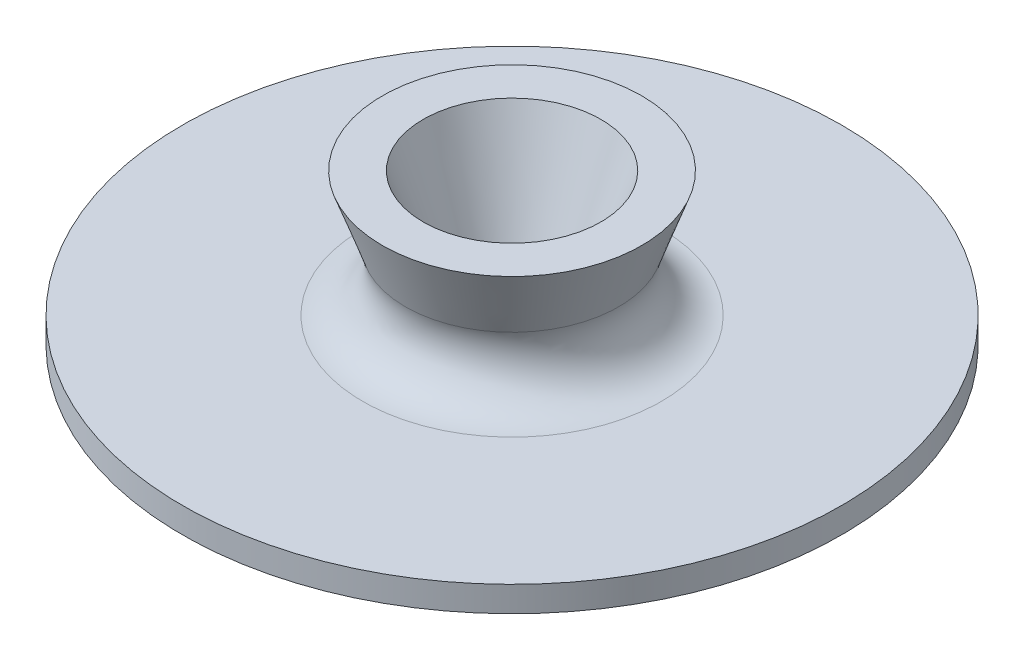
ISO-10303-21;
HEADER;
FILE_DESCRIPTION(('STEP AP214'),'2;1');
FILE_NAME('part.step','',(''),(''),'','','');
FILE_SCHEMA(('AUTOMOTIVE_DESIGN { 1 0 10303 214 1 1 1 1 }'));
ENDSEC;
DATA;
#1=APPLICATION_CONTEXT('core data for automotive mechanical design processes');
#2=APPLICATION_PROTOCOL_DEFINITION('international standard','automotive_design',2000,#1);
#3=PRODUCT_CONTEXT('',#1,'mechanical');
#4=PRODUCT('Part','Part','',(#3));
#5=PRODUCT_RELATED_PRODUCT_CATEGORY('part','',(#4));
#6=PRODUCT_DEFINITION_FORMATION('','',#4);
#7=PRODUCT_DEFINITION_CONTEXT('part definition',#1,'design');
#8=PRODUCT_DEFINITION('design','',#6,#7);
#9=PRODUCT_DEFINITION_SHAPE('','',#8);
#10=(LENGTH_UNIT() NAMED_UNIT(*) SI_UNIT(.MILLI.,.METRE.));
#11=(NAMED_UNIT(*) PLANE_ANGLE_UNIT() SI_UNIT($,.RADIAN.));
#12=(NAMED_UNIT(*) SI_UNIT($,.STERADIAN.) SOLID_ANGLE_UNIT());
#13=UNCERTAINTY_MEASURE_WITH_UNIT(LENGTH_MEASURE(1.E-05),#10,'distance_accuracy_value','');
#14=(GEOMETRIC_REPRESENTATION_CONTEXT(3) GLOBAL_UNCERTAINTY_ASSIGNED_CONTEXT((#13)) GLOBAL_UNIT_ASSIGNED_CONTEXT((#10,
#11,#12)) REPRESENTATION_CONTEXT('',''));
#15=CARTESIAN_POINT('',(0.,0.,0.));
#16=DIRECTION('',(0.,0.,1.));
#17=DIRECTION('',(1.,0.,0.));
#18=AXIS2_PLACEMENT_3D('',#15,#16,#17);
#19=CARTESIAN_POINT('',(-19.6076033884728,27.621968932787,0.));
#20=DIRECTION('',(0.,-1.,0.));
#21=DIRECTION('',(0.,0.,-1.));
#22=AXIS2_PLACEMENT_3D('',#19,#20,#21);
#23=PLANE('',#22);
#24=CARTESIAN_POINT('',(0.,27.621968932787,0.));
#25=DIRECTION('',(0.,-1.,0.));
#26=DIRECTION('',(0.,0.,-1.));
#27=AXIS2_PLACEMENT_3D('',#24,#25,#26);
#28=CIRCLE('',#27,28.6091637893943);
#29=CARTESIAN_POINT('',(0.,27.621968932787,-28.6091637893943));
#30=VERTEX_POINT('',#29);
#31=EDGE_CURVE('E55',#30,#30,#28,.T.);
#32=ORIENTED_EDGE('',*,*,#31,.F.);
#33=EDGE_LOOP('',(#32));
#34=FACE_BOUND('',#33,.T.);
#35=CARTESIAN_POINT('',(0.,27.621968932787,0.));
#36=DIRECTION('',(0.,-1.,0.));
#37=DIRECTION('',(0.,0.,-1.));
#38=AXIS2_PLACEMENT_3D('',#35,#36,#37);
#39=CIRCLE('',#38,19.6076033884728);
#40=CARTESIAN_POINT('',(0.,27.6219689327871,19.6076033884728));
#41=VERTEX_POINT('',#40);
#42=EDGE_CURVE('E50',#41,#41,#39,.T.);
#43=ORIENTED_EDGE('',*,*,#42,.T.);
#44=EDGE_LOOP('',(#43));
#45=FACE_BOUND('',#44,.T.);
#46=ADVANCED_FACE('F37',(#34,#45),#23,.F.);
#47=CARTESIAN_POINT('',(0.,27.621968932787,0.));
#48=DIRECTION('',(0.,1.,0.));
#49=DIRECTION('',(0.,0.,1.));
#50=AXIS2_PLACEMENT_3D('',#47,#48,#49);
#51=CONICAL_SURFACE('',#50,28.6091637893943,0.343023940420704);
#52=CARTESIAN_POINT('',(0.,13.3633639699816,0.));
#53=DIRECTION('',(0.,1.,0.));
#54=DIRECTION('',(0.,0.,1.));
#55=AXIS2_PLACEMENT_3D('',#52,#53,#54);
#56=CIRCLE('',#55,23.5168048741066);
#57=CARTESIAN_POINT('',(0.,13.3633639699816,23.5168048741066));
#58=VERTEX_POINT('',#57);
#59=EDGE_CURVE('E10',#58,#58,#56,.T.);
#60=ORIENTED_EDGE('',*,*,#59,.T.);
#61=EDGE_LOOP('',(#60));
#62=FACE_BOUND('',#61,.T.);
#63=ORIENTED_EDGE('',*,*,#31,.T.);
#64=EDGE_LOOP('',(#63));
#65=FACE_BOUND('',#64,.T.);
#66=ADVANCED_FACE('F110',(#62,#65),#51,.T.);
#67=CARTESIAN_POINT('',(-18.7441748848275,0.,0.));
#68=DIRECTION('',(0.,-1.,0.));
#69=DIRECTION('',(0.,0.,-1.));
#70=AXIS2_PLACEMENT_3D('',#67,#68,#69);
#71=PLANE('',#70);
#72=CARTESIAN_POINT('',(0.,0.,0.));
#73=DIRECTION('',(0.,-1.,0.));
#74=DIRECTION('',(0.,0.,-1.));
#75=AXIS2_PLACEMENT_3D('',#72,#73,#74);
#76=CIRCLE('',#75,32.934223990055);
#77=CARTESIAN_POINT('',(0.,0.,-32.934223990055));
#78=VERTEX_POINT('',#77);
#79=EDGE_CURVE('E45',#78,#78,#76,.T.);
#80=ORIENTED_EDGE('',*,*,#79,.T.);
#81=EDGE_LOOP('',(#80));
#82=FACE_BOUND('',#81,.T.);
#83=CARTESIAN_POINT('',(0.,0.,0.));
#84=DIRECTION('',(0.,-1.,0.));
#85=DIRECTION('',(0.,0.,-1.));
#86=AXIS2_PLACEMENT_3D('',#83,#84,#85);
#87=CIRCLE('',#86,72.6915818781796);
#88=CARTESIAN_POINT('',(0.,0.,-72.6915818781796));
#89=VERTEX_POINT('',#88);
#90=EDGE_CURVE('E61',#89,#89,#87,.T.);
#91=ORIENTED_EDGE('',*,*,#90,.F.);
#92=EDGE_LOOP('',(#91));
#93=FACE_BOUND('',#92,.T.);
#94=ADVANCED_FACE('F105',(#82,#93),#71,.F.);
#95=CARTESIAN_POINT('',(0.,0.,0.));
#96=DIRECTION('',(0.,-1.,0.));
#97=DIRECTION('',(0.,0.,-1.));
#98=AXIS2_PLACEMENT_3D('',#95,#96,#97);
#99=CYLINDRICAL_SURFACE('',#98,72.6915818781796);
#100=CARTESIAN_POINT('',(0.,-5.61608474117981,0.));
#101=DIRECTION('',(0.,-1.,0.));
#102=DIRECTION('',(0.,0.,-1.));
#103=AXIS2_PLACEMENT_3D('',#100,#101,#102);
#104=CIRCLE('',#103,72.6915818781796);
#105=CARTESIAN_POINT('',(0.,-5.61608474117981,-72.6915818781796));
#106=VERTEX_POINT('',#105);
#107=EDGE_CURVE('E65',#106,#106,#104,.T.);
#108=ORIENTED_EDGE('',*,*,#107,.F.);
#109=EDGE_LOOP('',(#108));
#110=FACE_BOUND('',#109,.T.);
#111=ORIENTED_EDGE('',*,*,#90,.T.);
#112=EDGE_LOOP('',(#111));
#113=FACE_BOUND('',#112,.T.);
#114=ADVANCED_FACE('F99',(#110,#113),#99,.T.);
#115=CARTESIAN_POINT('',(-72.6915818781796,-5.61608474117981,0.));
#116=DIRECTION('',(0.,1.,0.));
#117=DIRECTION('',(0.,0.,1.));
#118=AXIS2_PLACEMENT_3D('',#115,#116,#117);
#119=PLANE('',#118);
#120=CARTESIAN_POINT('',(0.,-5.61608474117981,0.));
#121=DIRECTION('',(0.,-1.,0.));
#122=DIRECTION('',(0.,0.,-1.));
#123=AXIS2_PLACEMENT_3D('',#120,#121,#122);
#124=CIRCLE('',#123,13.3707970426537);
#125=CARTESIAN_POINT('',(0.,-5.61608474117981,-13.3707970426537));
#126=VERTEX_POINT('',#125);
#127=EDGE_CURVE('E69',#126,#126,#124,.T.);
#128=ORIENTED_EDGE('',*,*,#127,.F.);
#129=EDGE_LOOP('',(#128));
#130=FACE_BOUND('',#129,.T.);
#131=ORIENTED_EDGE('',*,*,#107,.T.);
#132=EDGE_LOOP('',(#131));
#133=FACE_BOUND('',#132,.T.);
#134=ADVANCED_FACE('F93',(#130,#133),#119,.F.);
#135=CARTESIAN_POINT('',(0.,-5.61608474117981,0.));
#136=DIRECTION('',(0.,1.,0.));
#137=DIRECTION('',(0.,0.,1.));
#138=AXIS2_PLACEMENT_3D('',#135,#136,#137);
#139=CONICAL_SURFACE('',#138,13.3707970426537,0.343023940420704);
#140=CARTESIAN_POINT('',(0.,-15.7749959056735,0.));
#141=DIRECTION('',(0.,-1.,0.));
#142=DIRECTION('',(0.,0.,-1.));
#143=AXIS2_PLACEMENT_3D('',#140,#141,#142);
#144=CIRCLE('',#143,9.74261448390595);
#145=CARTESIAN_POINT('',(0.,-15.7749959056735,-9.74261448390595));
#146=VERTEX_POINT('',#145);
#147=EDGE_CURVE('E73',#146,#146,#144,.T.);
#148=ORIENTED_EDGE('',*,*,#147,.F.);
#149=EDGE_LOOP('',(#148));
#150=FACE_BOUND('',#149,.T.);
#151=ORIENTED_EDGE('',*,*,#127,.T.);
#152=EDGE_LOOP('',(#151));
#153=FACE_BOUND('',#152,.T.);
#154=ADVANCED_FACE('F87',(#150,#153),#139,.T.);
#155=CARTESIAN_POINT('',(-4.10868737473681,-15.7749959056735,0.));
#156=DIRECTION('',(0.,1.,0.));
#157=DIRECTION('',(0.,0.,1.));
#158=AXIS2_PLACEMENT_3D('',#155,#156,#157);
#159=PLANE('',#158);
#160=CARTESIAN_POINT('',(0.,-15.7749959056735,0.));
#161=DIRECTION('',(0.,-1.,0.));
#162=DIRECTION('',(0.,0.,-1.));
#163=AXIS2_PLACEMENT_3D('',#160,#161,#162);
#164=CIRCLE('',#163,4.10868737473681);
#165=CARTESIAN_POINT('',(0.,-15.7749959056735,4.10868737473681));
#166=VERTEX_POINT('',#165);
#167=EDGE_CURVE('E77',#166,#166,#164,.T.);
#168=ORIENTED_EDGE('',*,*,#167,.F.);
#169=EDGE_LOOP('',(#168));
#170=FACE_BOUND('',#169,.T.);
#171=ORIENTED_EDGE('',*,*,#147,.T.);
#172=EDGE_LOOP('',(#171));
#173=FACE_BOUND('',#172,.T.);
#174=ADVANCED_FACE('F84',(#170,#173),#159,.F.);
#175=CARTESIAN_POINT('',(0.,-15.7749959056735,0.));
#176=DIRECTION('',(0.,1.,0.));
#177=DIRECTION('',(0.,0.,1.));
#178=AXIS2_PLACEMENT_3D('',#175,#176,#177);
#179=CONICAL_SURFACE('',#178,4.10868737473681,0.343023940420704);
#180=CARTESIAN_POINT('',(0.,27.6219689327871,19.6076033884728));
#181=CARTESIAN_POINT('',(0.,27.1699172157198,19.446156346663));
#182=CARTESIAN_POINT('',(0.,26.7178654986525,19.2847093048533));
#183=CARTESIAN_POINT('',(0.,25.8137620645179,18.9618152212338));
#184=CARTESIAN_POINT('',(0.,25.3617103474506,18.800368179424));
#185=CARTESIAN_POINT('',(0.,24.457606913316,18.4774740958045));
#186=CARTESIAN_POINT('',(0.,24.0055551962487,18.3160270539948));
#187=CARTESIAN_POINT('',(0.,23.1014517621141,17.9931329703753));
#188=CARTESIAN_POINT('',(0.,22.6494000450468,17.8316859285655));
#189=CARTESIAN_POINT('',(0.,21.7452966109122,17.508791844946));
#190=CARTESIAN_POINT('',(0.,21.2932448938449,17.3473448031363));
#191=CARTESIAN_POINT('',(0.,20.3891414597103,17.0244507195168));
#192=CARTESIAN_POINT('',(0.,19.937089742643,16.863003677707));
#193=CARTESIAN_POINT('',(0.,19.0329863085084,16.5401095940875));
#194=CARTESIAN_POINT('',(0.,18.5809345914411,16.3786625522778));
#195=CARTESIAN_POINT('',(0.,17.6768311573065,16.0557684686583));
#196=CARTESIAN_POINT('',(0.,17.2247794402392,15.8943214268485));
#197=CARTESIAN_POINT('',(0.,16.3206760061046,15.571427343229));
#198=CARTESIAN_POINT('',(0.,15.8686242890373,15.4099803014193));
#199=CARTESIAN_POINT('',(0.,14.9645208549027,15.0870862177998));
#200=CARTESIAN_POINT('',(0.,14.5124691378354,14.92563917599));
#201=CARTESIAN_POINT('',(0.,13.6083657037008,14.6027450923705));
#202=CARTESIAN_POINT('',(0.,13.1563139866335,14.4412980505608));
#203=CARTESIAN_POINT('',(0.,12.2522105524989,14.1184039669413));
#204=CARTESIAN_POINT('',(0.,11.8001588354316,13.9569569251315));
#205=CARTESIAN_POINT('',(0.,10.896055401297,13.634062841512));
#206=CARTESIAN_POINT('',(0.,10.4440036842297,13.4726157997023));
#207=CARTESIAN_POINT('',(0.,9.53990025009514,13.1497217160828));
#208=CARTESIAN_POINT('',(0.,9.08784853302784,12.9882746742731));
#209=CARTESIAN_POINT('',(0.,8.18374509889324,12.6653805906535));
#210=CARTESIAN_POINT('',(0.,7.73169338182594,12.5039335488438));
#211=CARTESIAN_POINT('',(0.,6.82758994769135,12.1810394652243));
#212=CARTESIAN_POINT('',(0.,6.37553823062405,12.0195924234146));
#213=CARTESIAN_POINT('',(0.,5.47143479648945,11.6966983397951));
#214=CARTESIAN_POINT('',(0.,5.01938307942216,11.5352512979853));
#215=CARTESIAN_POINT('',(0.,4.11527964528756,11.2123572143658));
#216=CARTESIAN_POINT('',(0.,3.66322792822026,11.0509101725561));
#217=CARTESIAN_POINT('',(0.,2.75912449408567,10.7280160889366));
#218=CARTESIAN_POINT('',(0.,2.30707277701837,10.5665690471268));
#219=CARTESIAN_POINT('',(0.,1.40296934288377,10.2436749635073));
#220=CARTESIAN_POINT('',(0.,0.950917625816473,10.0822279216976));
#221=CARTESIAN_POINT('',(0.,0.0468141916818765,9.75933383807805));
#222=CARTESIAN_POINT('',(0.,-0.405237525385421,9.5978867962683));
#223=CARTESIAN_POINT('',(0.,-1.30934095952002,9.2749927126488));
#224=CARTESIAN_POINT('',(0.,-1.76139267658731,9.11354567083905));
#225=CARTESIAN_POINT('',(0.,-2.66549611072191,8.79065158721955));
#226=CARTESIAN_POINT('',(0.,-3.11754782778921,8.6292045454098));
#227=CARTESIAN_POINT('',(0.,-4.0216512619238,8.30631046179031));
#228=CARTESIAN_POINT('',(0.,-4.4737029789911,8.14486341998056));
#229=CARTESIAN_POINT('',(0.,-5.3778064131257,7.82196933636106));
#230=CARTESIAN_POINT('',(0.,-5.82985813019299,7.66052229455131));
#231=CARTESIAN_POINT('',(0.,-6.73396156432759,7.33762821093181));
#232=CARTESIAN_POINT('',(0.,-7.18601328139489,7.17618116912206));
#233=CARTESIAN_POINT('',(0.,-8.09011671552949,6.85328708550256));
#234=CARTESIAN_POINT('',(0.,-8.54216843259679,6.69184004369281));
#235=CARTESIAN_POINT('',(0.,-9.44627186673138,6.36894596007331));
#236=CARTESIAN_POINT('',(0.,-9.89832358379868,6.20749891826356));
#237=CARTESIAN_POINT('',(0.,-10.8024270179333,5.88460483464406));
#238=CARTESIAN_POINT('',(0.,-11.2544787350006,5.72315779283431));
#239=CARTESIAN_POINT('',(0.,-12.1585821691352,5.40026370921481));
#240=CARTESIAN_POINT('',(0.,-12.6106338862025,5.23881666740506));
#241=CARTESIAN_POINT('',(0.,-13.5147373203371,4.91592258378556));
#242=CARTESIAN_POINT('',(0.,-13.9667890374044,4.75447554197581));
#243=CARTESIAN_POINT('',(0.,-14.870892471539,4.43158145835631));
#244=CARTESIAN_POINT('',(0.,-15.3229441886063,4.27013441654656));
#245=CARTESIAN_POINT('',(0.,-15.7749959056735,4.10868737473681));
#246=B_SPLINE_CURVE_WITH_KNOTS('',3,(#180,#181,#182,#183,#184,#185,#186,#187,#188,#189,#190,
#191,#192,#193,#194,#195,#196,#197,#198,#199,#200,#201,#202,#203,#204,#205,#206,#207,#208,#209,
#210,#211,#212,#213,#214,#215,#216,#217,#218,#219,#220,#221,#222,#223,#224,#225,#226,#227,#228,
#229,#230,#231,#232,#233,#234,#235,#236,#237,#238,#239,#240,#241,#242,#243,#244,#245),
.UNSPECIFIED.,.F.,.F.,(4,2,2,2,2,2,2,2,2,2,2,2,2,2,2,2,2,2,2,2,2,2,2,2,2,2,2,2,2,2,2,2,4),(0.,
1.44004969355697,2.88009938711392,4.32014908067089,5.76019877422785,7.20024846778481,
8.64029816134178,10.0803478548987,11.5203975484557,12.9604472420127,14.4004969355696,
15.8405466291266,17.2805963226836,18.7206460162405,20.1606957097975,21.6007454033544,
23.0407950969114,24.4808447904684,25.9208944840253,27.3609441775823,28.8009938711393,
30.2410435646962,31.6810932582532,33.1211429518101,34.5611926453671,36.0012423389241,
37.441292032481,38.881341726038,40.321391419595,41.7614411131519,43.2014908067089,
44.6415405002659,46.0815901938228),.UNSPECIFIED.);
#247=EDGE_CURVE('BSEAM82',#41,#166,#246,.T.);
#248=ORIENTED_EDGE('',*,*,#42,.F.);
#249=ORIENTED_EDGE('',*,*,#167,.T.);
#250=ORIENTED_EDGE('',*,*,#247,.T.);
#251=ORIENTED_EDGE('',*,*,#247,.F.);
#252=EDGE_LOOP('',(#248,#250,#249,#251));
#253=FACE_BOUND('',#252,.T.);
#254=ADVANCED_FACE('F82',(#253),#179,.F.);
#255=CARTESIAN_POINT('',(0.,10.,0.));
#256=DIRECTION('',(0.,-1.,0.));
#257=DIRECTION('',(0.,0.,-1.));
#258=AXIS2_PLACEMENT_3D('',#255,#256,#257);
#259=TOROIDAL_SURFACE('',#258,32.934223990055,10.);
#260=ORIENTED_EDGE('',*,*,#59,.F.);
#261=EDGE_LOOP('',(#260));
#262=FACE_BOUND('',#261,.T.);
#263=ORIENTED_EDGE('',*,*,#79,.F.);
#264=EDGE_LOOP('',(#263));
#265=FACE_BOUND('',#264,.T.);
#266=ADVANCED_FACE('F39',(#262,#265),#259,.F.);
#267=CLOSED_SHELL('',(#46,#66,#94,#114,#134,#154,#174,#254,#266));
#268=MANIFOLD_SOLID_BREP('B2',#267);
#269=ADVANCED_BREP_SHAPE_REPRESENTATION('',(#18,#268),#14);
#270=SHAPE_DEFINITION_REPRESENTATION(#9,#269);
ENDSEC;
END-ISO-10303-21;
